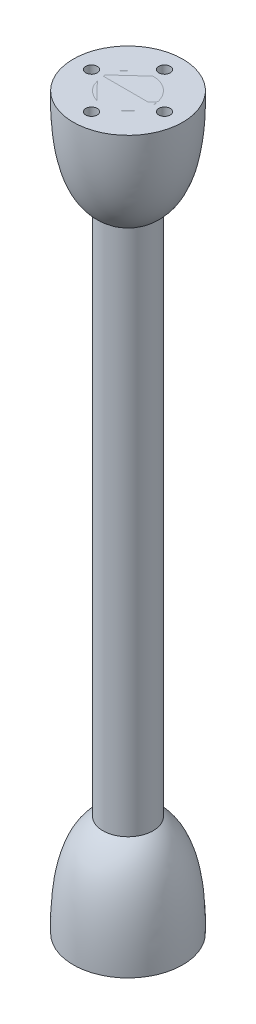
ISO-10303-21;
HEADER;
FILE_DESCRIPTION(('STEP AP214'),'2;1');
FILE_NAME('part.step','',(''),(''),'','','');
FILE_SCHEMA(('AUTOMOTIVE_DESIGN { 1 0 10303 214 1 1 1 1 }'));
ENDSEC;
DATA;
#1=APPLICATION_CONTEXT('core data for automotive mechanical design processes');
#2=APPLICATION_PROTOCOL_DEFINITION('international standard','automotive_design',2000,#1);
#3=PRODUCT_CONTEXT('',#1,'mechanical');
#4=PRODUCT('Part','Part','',(#3));
#5=PRODUCT_RELATED_PRODUCT_CATEGORY('part','',(#4));
#6=PRODUCT_DEFINITION_FORMATION('','',#4);
#7=PRODUCT_DEFINITION_CONTEXT('part definition',#1,'design');
#8=PRODUCT_DEFINITION('design','',#6,#7);
#9=PRODUCT_DEFINITION_SHAPE('','',#8);
#10=(LENGTH_UNIT() NAMED_UNIT(*) SI_UNIT(.MILLI.,.METRE.));
#11=(NAMED_UNIT(*) PLANE_ANGLE_UNIT() SI_UNIT($,.RADIAN.));
#12=(NAMED_UNIT(*) SI_UNIT($,.STERADIAN.) SOLID_ANGLE_UNIT());
#13=UNCERTAINTY_MEASURE_WITH_UNIT(LENGTH_MEASURE(1.E-05),#10,'distance_accuracy_value','');
#14=(GEOMETRIC_REPRESENTATION_CONTEXT(3) GLOBAL_UNCERTAINTY_ASSIGNED_CONTEXT((#13)) GLOBAL_UNIT_ASSIGNED_CONTEXT((#10,
#11,#12)) REPRESENTATION_CONTEXT('',''));
#15=CARTESIAN_POINT('',(0.,0.,0.));
#16=DIRECTION('',(0.,0.,1.));
#17=DIRECTION('',(1.,0.,0.));
#18=AXIS2_PLACEMENT_3D('',#15,#16,#17);
#19=CARTESIAN_POINT('',(0.,215.9,0.));
#20=CARTESIAN_POINT('',(19.7530600429032,216.871645918133,0.));
#21=CARTESIAN_POINT('',(19.05,254.,0.));
#22=B_SPLINE_CURVE_WITH_KNOTS('',2,(#19,#20,#21),.UNSPECIFIED.,.F.,.F.,(3,3),(0.,1.),.UNSPECIFIED.);
#23=CARTESIAN_POINT('',(0.,0.,0.));
#24=DIRECTION('',(0.,-1.,0.));
#25=AXIS1_PLACEMENT('',#23,#24);
#26=SURFACE_OF_REVOLUTION('',#22,#25);
#27=CARTESIAN_POINT('',(0.,254.,0.));
#28=DIRECTION('',(0.,-1.,0.));
#29=DIRECTION('',(0.,0.,-1.));
#30=AXIS2_PLACEMENT_3D('',#27,#28,#29);
#31=CIRCLE('',#30,19.05);
#32=CARTESIAN_POINT('',(0.,254.,-19.05));
#33=VERTEX_POINT('',#32);
#34=EDGE_CURVE('E12',#33,#33,#31,.T.);
#35=ORIENTED_EDGE('',*,*,#34,.T.);
#36=EDGE_LOOP('',(#35));
#37=FACE_BOUND('',#36,.T.);
#38=CARTESIAN_POINT('',(0.,215.9,0.));
#39=VERTEX_POINT('',#38);
#40=VERTEX_LOOP('',#39);
#41=FACE_BOUND('',#40,.T.);
#42=ADVANCED_FACE('F47',(#37,#41),#26,.F.);
#43=CARTESIAN_POINT('',(0.,254.,0.));
#44=DIRECTION('',(0.,1.,0.));
#45=DIRECTION('',(0.,0.,1.));
#46=AXIS2_PLACEMENT_3D('',#43,#44,#45);
#47=PLANE('',#46);
#48=CARTESIAN_POINT('',(12.7,254.,0.));
#49=DIRECTION('',(0.,1.,0.));
#50=DIRECTION('',(0.,0.,1.));
#51=AXIS2_PLACEMENT_3D('',#48,#49,#50);
#52=CIRCLE('',#51,2.00000006400001);
#53=CARTESIAN_POINT('',(12.7,254.,2.00000006400001));
#54=VERTEX_POINT('',#53);
#55=EDGE_CURVE('E105',#54,#54,#52,.T.);
#56=ORIENTED_EDGE('',*,*,#55,.F.);
#57=EDGE_LOOP('',(#56));
#58=FACE_BOUND('',#57,.T.);
#59=CARTESIAN_POINT('',(-12.7,254.,0.));
#60=DIRECTION('',(0.,1.,0.));
#61=DIRECTION('',(0.,0.,1.));
#62=AXIS2_PLACEMENT_3D('',#59,#60,#61);
#63=CIRCLE('',#62,2.000000064);
#64=CARTESIAN_POINT('',(-12.7,254.,2.000000064));
#65=VERTEX_POINT('',#64);
#66=EDGE_CURVE('E108',#65,#65,#63,.T.);
#67=ORIENTED_EDGE('',*,*,#66,.F.);
#68=EDGE_LOOP('',(#67));
#69=FACE_BOUND('',#68,.T.);
#70=CARTESIAN_POINT('',(0.,254.,-12.7));
#71=DIRECTION('',(0.,1.,0.));
#72=DIRECTION('',(0.,0.,1.));
#73=AXIS2_PLACEMENT_3D('',#70,#71,#72);
#74=CIRCLE('',#73,2.000000064);
#75=CARTESIAN_POINT('',(0.,254.,-10.699999936));
#76=VERTEX_POINT('',#75);
#77=EDGE_CURVE('E116',#76,#76,#74,.T.);
#78=ORIENTED_EDGE('',*,*,#77,.F.);
#79=EDGE_LOOP('',(#78));
#80=FACE_BOUND('',#79,.T.);
#81=CARTESIAN_POINT('',(0.,254.,12.7));
#82=DIRECTION('',(0.,1.,0.));
#83=DIRECTION('',(0.,0.,1.));
#84=AXIS2_PLACEMENT_3D('',#81,#82,#83);
#85=CIRCLE('',#84,2.000000064);
#86=CARTESIAN_POINT('',(0.,254.,14.700000064));
#87=VERTEX_POINT('',#86);
#88=EDGE_CURVE('E122',#87,#87,#85,.T.);
#89=ORIENTED_EDGE('',*,*,#88,.F.);
#90=EDGE_LOOP('',(#89));
#91=FACE_BOUND('',#90,.T.);
#92=ORIENTED_EDGE('',*,*,#34,.F.);
#93=EDGE_LOOP('',(#92));
#94=FACE_BOUND('',#93,.T.);
#95=ADVANCED_FACE('F57',(#58,#69,#80,#91,#94),#47,.T.);
#96=CARTESIAN_POINT('',(0.,247.00000003,12.7));
#97=DIRECTION('',(0.,1.,0.));
#98=DIRECTION('',(0.,0.,1.));
#99=AXIS2_PLACEMENT_3D('',#96,#97,#98);
#100=CYLINDRICAL_SURFACE('',#99,2.000000064);
#101=CARTESIAN_POINT('',(0.,247.00000003,12.7));
#102=DIRECTION('',(0.,1.,0.));
#103=DIRECTION('',(0.,0.,1.));
#104=AXIS2_PLACEMENT_3D('',#101,#102,#103);
#105=CIRCLE('',#104,2.000000064);
#106=CARTESIAN_POINT('',(0.,247.00000003,14.700000064));
#107=VERTEX_POINT('',#106);
#108=EDGE_CURVE('E125',#107,#107,#105,.T.);
#109=ORIENTED_EDGE('',*,*,#108,.F.);
#110=EDGE_LOOP('',(#109));
#111=FACE_BOUND('',#110,.T.);
#112=ORIENTED_EDGE('',*,*,#88,.T.);
#113=EDGE_LOOP('',(#112));
#114=FACE_BOUND('',#113,.T.);
#115=ADVANCED_FACE('F62',(#111,#114),#100,.F.);
#116=CARTESIAN_POINT('',(0.,247.00000003,12.7));
#117=DIRECTION('',(0.,1.,0.));
#118=DIRECTION('',(0.,0.,1.));
#119=AXIS2_PLACEMENT_3D('',#116,#117,#118);
#120=PLANE('',#119);
#121=ORIENTED_EDGE('',*,*,#108,.T.);
#122=EDGE_LOOP('',(#121));
#123=FACE_BOUND('',#122,.T.);
#124=ADVANCED_FACE('F69',(#123),#120,.T.);
#125=CARTESIAN_POINT('',(0.,247.00000003,-12.7));
#126=DIRECTION('',(0.,1.,0.));
#127=DIRECTION('',(0.,0.,1.));
#128=AXIS2_PLACEMENT_3D('',#125,#126,#127);
#129=CYLINDRICAL_SURFACE('',#128,2.000000064);
#130=CARTESIAN_POINT('',(0.,247.00000003,-12.7));
#131=DIRECTION('',(0.,1.,0.));
#132=DIRECTION('',(0.,0.,1.));
#133=AXIS2_PLACEMENT_3D('',#130,#131,#132);
#134=CIRCLE('',#133,2.000000064);
#135=CARTESIAN_POINT('',(0.,247.00000003,-10.699999936));
#136=VERTEX_POINT('',#135);
#137=EDGE_CURVE('E119',#136,#136,#134,.T.);
#138=ORIENTED_EDGE('',*,*,#137,.F.);
#139=EDGE_LOOP('',(#138));
#140=FACE_BOUND('',#139,.T.);
#141=ORIENTED_EDGE('',*,*,#77,.T.);
#142=EDGE_LOOP('',(#141));
#143=FACE_BOUND('',#142,.T.);
#144=ADVANCED_FACE('F76',(#140,#143),#129,.F.);
#145=CARTESIAN_POINT('',(0.,247.00000003,-12.7));
#146=DIRECTION('',(0.,1.,0.));
#147=DIRECTION('',(0.,0.,1.));
#148=AXIS2_PLACEMENT_3D('',#145,#146,#147);
#149=PLANE('',#148);
#150=ORIENTED_EDGE('',*,*,#137,.T.);
#151=EDGE_LOOP('',(#150));
#152=FACE_BOUND('',#151,.T.);
#153=ADVANCED_FACE('F79',(#152),#149,.T.);
#154=CARTESIAN_POINT('',(-12.7,247.00000003,0.));
#155=DIRECTION('',(0.,1.,0.));
#156=DIRECTION('',(0.,0.,1.));
#157=AXIS2_PLACEMENT_3D('',#154,#155,#156);
#158=CYLINDRICAL_SURFACE('',#157,2.000000064);
#159=CARTESIAN_POINT('',(-12.7,247.00000003,0.));
#160=DIRECTION('',(0.,1.,0.));
#161=DIRECTION('',(0.,0.,1.));
#162=AXIS2_PLACEMENT_3D('',#159,#160,#161);
#163=CIRCLE('',#162,2.000000064);
#164=CARTESIAN_POINT('',(-12.7,247.00000003,2.000000064));
#165=VERTEX_POINT('',#164);
#166=EDGE_CURVE('E113',#165,#165,#163,.T.);
#167=ORIENTED_EDGE('',*,*,#166,.F.);
#168=EDGE_LOOP('',(#167));
#169=FACE_BOUND('',#168,.T.);
#170=ORIENTED_EDGE('',*,*,#66,.T.);
#171=EDGE_LOOP('',(#170));
#172=FACE_BOUND('',#171,.T.);
#173=ADVANCED_FACE('F82',(#169,#172),#158,.F.);
#174=CARTESIAN_POINT('',(-12.7,247.00000003,0.));
#175=DIRECTION('',(0.,1.,0.));
#176=DIRECTION('',(0.,0.,1.));
#177=AXIS2_PLACEMENT_3D('',#174,#175,#176);
#178=PLANE('',#177);
#179=ORIENTED_EDGE('',*,*,#166,.T.);
#180=EDGE_LOOP('',(#179));
#181=FACE_BOUND('',#180,.T.);
#182=ADVANCED_FACE('F87',(#181),#178,.T.);
#183=CARTESIAN_POINT('',(12.7,247.00000003,0.));
#184=DIRECTION('',(0.,1.,0.));
#185=DIRECTION('',(0.,0.,1.));
#186=AXIS2_PLACEMENT_3D('',#183,#184,#185);
#187=CYLINDRICAL_SURFACE('',#186,2.00000006400001);
#188=CARTESIAN_POINT('',(12.7,247.00000003,0.));
#189=DIRECTION('',(0.,1.,0.));
#190=DIRECTION('',(0.,0.,1.));
#191=AXIS2_PLACEMENT_3D('',#188,#189,#190);
#192=CIRCLE('',#191,2.00000006400001);
#193=CARTESIAN_POINT('',(12.7,247.00000003,2.00000006400001));
#194=VERTEX_POINT('',#193);
#195=EDGE_CURVE('E53',#194,#194,#192,.T.);
#196=ORIENTED_EDGE('',*,*,#195,.F.);
#197=EDGE_LOOP('',(#196));
#198=FACE_BOUND('',#197,.T.);
#199=ORIENTED_EDGE('',*,*,#55,.T.);
#200=EDGE_LOOP('',(#199));
#201=FACE_BOUND('',#200,.T.);
#202=ADVANCED_FACE('F90',(#198,#201),#187,.F.);
#203=CARTESIAN_POINT('',(12.7,247.00000003,0.));
#204=DIRECTION('',(0.,1.,0.));
#205=DIRECTION('',(0.,0.,1.));
#206=AXIS2_PLACEMENT_3D('',#203,#204,#205);
#207=PLANE('',#206);
#208=ORIENTED_EDGE('',*,*,#195,.T.);
#209=EDGE_LOOP('',(#208));
#210=FACE_BOUND('',#209,.T.);
#211=ADVANCED_FACE('F97',(#210),#207,.T.);
#212=CLOSED_SHELL('',(#42,#95,#115,#124,#144,#153,#173,#182,#202,#211));
#213=MANIFOLD_SOLID_BREP('B2',#212);
#214=CARTESIAN_POINT('',(0.,0.,0.));
#215=DIRECTION('',(0.,-1.,0.));
#216=DIRECTION('',(0.,0.,-1.));
#217=AXIS2_PLACEMENT_3D('',#214,#215,#216);
#218=PLANE('',#217);
#219=CARTESIAN_POINT('',(12.7,0.,0.));
#220=DIRECTION('',(0.,-1.,0.));
#221=DIRECTION('',(0.,0.,-1.));
#222=AXIS2_PLACEMENT_3D('',#219,#220,#221);
#223=CIRCLE('',#222,2.000000064);
#224=CARTESIAN_POINT('',(12.7,0.,-2.000000064));
#225=VERTEX_POINT('',#224);
#226=EDGE_CURVE('E278',#225,#225,#223,.T.);
#227=ORIENTED_EDGE('',*,*,#226,.F.);
#228=EDGE_LOOP('',(#227));
#229=FACE_BOUND('',#228,.T.);
#230=CARTESIAN_POINT('',(-12.7,0.,0.));
#231=DIRECTION('',(0.,-1.,0.));
#232=DIRECTION('',(0.,0.,-1.));
#233=AXIS2_PLACEMENT_3D('',#230,#231,#232);
#234=CIRCLE('',#233,2.000000064);
#235=CARTESIAN_POINT('',(-12.7,0.,-2.000000064));
#236=VERTEX_POINT('',#235);
#237=EDGE_CURVE('E282',#236,#236,#234,.T.);
#238=ORIENTED_EDGE('',*,*,#237,.F.);
#239=EDGE_LOOP('',(#238));
#240=FACE_BOUND('',#239,.T.);
#241=CARTESIAN_POINT('',(0.,0.,12.7));
#242=DIRECTION('',(0.,-1.,0.));
#243=DIRECTION('',(0.,0.,-1.));
#244=AXIS2_PLACEMENT_3D('',#241,#242,#243);
#245=CIRCLE('',#244,2.000000064);
#246=CARTESIAN_POINT('',(0.,0.,10.699999936));
#247=VERTEX_POINT('',#246);
#248=EDGE_CURVE('E286',#247,#247,#245,.T.);
#249=ORIENTED_EDGE('',*,*,#248,.F.);
#250=EDGE_LOOP('',(#249));
#251=FACE_BOUND('',#250,.T.);
#252=CARTESIAN_POINT('',(0.,0.,-12.7));
#253=DIRECTION('',(0.,-1.,0.));
#254=DIRECTION('',(0.,0.,-1.));
#255=AXIS2_PLACEMENT_3D('',#252,#253,#254);
#256=CIRCLE('',#255,2.000000064);
#257=CARTESIAN_POINT('',(0.,0.,-14.700000064));
#258=VERTEX_POINT('',#257);
#259=EDGE_CURVE('E289',#258,#258,#256,.T.);
#260=ORIENTED_EDGE('',*,*,#259,.F.);
#261=EDGE_LOOP('',(#260));
#262=FACE_BOUND('',#261,.T.);
#263=CARTESIAN_POINT('',(0.,0.,0.));
#264=DIRECTION('',(0.,-1.,0.));
#265=DIRECTION('',(0.,0.,-1.));
#266=AXIS2_PLACEMENT_3D('',#263,#264,#265);
#267=CIRCLE('',#266,19.05);
#268=CARTESIAN_POINT('',(0.,0.,-19.05));
#269=VERTEX_POINT('',#268);
#270=EDGE_CURVE('E208',#269,#269,#267,.T.);
#271=ORIENTED_EDGE('',*,*,#270,.T.);
#272=EDGE_LOOP('',(#271));
#273=FACE_BOUND('',#272,.T.);
#274=ADVANCED_FACE('F202',(#229,#240,#251,#262,#273),#218,.T.);
#275=CARTESIAN_POINT('',(19.05,0.,0.));
#276=CARTESIAN_POINT('',(19.7530600429032,37.128354081867,0.));
#277=CARTESIAN_POINT('',(0.,38.1,0.));
#278=B_SPLINE_CURVE_WITH_KNOTS('',2,(#275,#276,#277),.UNSPECIFIED.,.F.,.F.,(3,3),(0.,1.),.UNSPECIFIED.);
#279=CARTESIAN_POINT('',(0.,0.,0.));
#280=DIRECTION('',(0.,-1.,0.));
#281=AXIS1_PLACEMENT('',#279,#280);
#282=SURFACE_OF_REVOLUTION('',#278,#281);
#283=CARTESIAN_POINT('',(0.,35.2622308884157,0.));
#284=DIRECTION('',(0.,-1.,0.));
#285=DIRECTION('',(0.,0.,-1.));
#286=AXIS2_PLACEMENT_3D('',#283,#284,#285);
#287=CIRCLE('',#286,8.73125);
#288=CARTESIAN_POINT('',(0.,35.2622308884157,-8.73125));
#289=VERTEX_POINT('',#288);
#290=EDGE_CURVE('E46',#289,#289,#287,.F.);
#291=ORIENTED_EDGE('',*,*,#290,.F.);
#292=EDGE_LOOP('',(#291));
#293=FACE_BOUND('',#292,.T.);
#294=ORIENTED_EDGE('',*,*,#270,.F.);
#295=EDGE_LOOP('',(#294));
#296=FACE_BOUND('',#295,.T.);
#297=ADVANCED_FACE('F226',(#293,#296),#282,.F.);
#298=CARTESIAN_POINT('',(0.,254.,0.));
#299=DIRECTION('',(0.,-1.,0.));
#300=DIRECTION('',(0.,0.,-1.));
#301=AXIS2_PLACEMENT_3D('',#298,#299,#300);
#302=CYLINDRICAL_SURFACE('',#301,8.73125);
#303=ORIENTED_EDGE('',*,*,#290,.T.);
#304=EDGE_LOOP('',(#303));
#305=FACE_BOUND('',#304,.T.);
#306=CARTESIAN_POINT('',(0.,254.,0.));
#307=DIRECTION('',(0.,-1.,0.));
#308=DIRECTION('',(0.,0.,-1.));
#309=AXIS2_PLACEMENT_3D('',#306,#307,#308);
#310=CIRCLE('',#309,8.73125);
#311=CARTESIAN_POINT('',(0.,254.,-8.73125));
#312=VERTEX_POINT('',#311);
#313=EDGE_CURVE('E212',#312,#312,#310,.T.);
#314=ORIENTED_EDGE('',*,*,#313,.T.);
#315=EDGE_LOOP('',(#314));
#316=FACE_BOUND('',#315,.T.);
#317=ADVANCED_FACE('F229',(#305,#316),#302,.T.);
#318=CARTESIAN_POINT('',(0.,254.,0.));
#319=DIRECTION('',(0.,-1.,0.));
#320=DIRECTION('',(0.,0.,-1.));
#321=AXIS2_PLACEMENT_3D('',#318,#319,#320);
#322=PLANE('',#321);
#323=ORIENTED_EDGE('',*,*,#313,.F.);
#324=EDGE_LOOP('',(#323));
#325=FACE_BOUND('',#324,.T.);
#326=ADVANCED_FACE('F233',(#325),#322,.F.);
#327=CARTESIAN_POINT('',(0.,6.99999997,-12.7));
#328=DIRECTION('',(0.,-1.,0.));
#329=DIRECTION('',(0.,0.,-1.));
#330=AXIS2_PLACEMENT_3D('',#327,#328,#329);
#331=CYLINDRICAL_SURFACE('',#330,2.000000064);
#332=CARTESIAN_POINT('',(0.,6.99999997,-12.7));
#333=DIRECTION('',(0.,-1.,0.));
#334=DIRECTION('',(0.,0.,-1.));
#335=AXIS2_PLACEMENT_3D('',#332,#333,#334);
#336=CIRCLE('',#335,2.000000064);
#337=CARTESIAN_POINT('',(0.,6.99999997,-14.700000064));
#338=VERTEX_POINT('',#337);
#339=EDGE_CURVE('E292',#338,#338,#336,.T.);
#340=ORIENTED_EDGE('',*,*,#339,.F.);
#341=EDGE_LOOP('',(#340));
#342=FACE_BOUND('',#341,.T.);
#343=ORIENTED_EDGE('',*,*,#259,.T.);
#344=EDGE_LOOP('',(#343));
#345=FACE_BOUND('',#344,.T.);
#346=ADVANCED_FACE('F236',(#342,#345),#331,.F.);
#347=CARTESIAN_POINT('',(0.,6.99999997,-12.7));
#348=DIRECTION('',(0.,-1.,0.));
#349=DIRECTION('',(0.,0.,-1.));
#350=AXIS2_PLACEMENT_3D('',#347,#348,#349);
#351=PLANE('',#350);
#352=ORIENTED_EDGE('',*,*,#339,.T.);
#353=EDGE_LOOP('',(#352));
#354=FACE_BOUND('',#353,.T.);
#355=ADVANCED_FACE('F238',(#354),#351,.T.);
#356=CARTESIAN_POINT('',(0.,6.99999997,12.7));
#357=DIRECTION('',(0.,-1.,0.));
#358=DIRECTION('',(0.,0.,-1.));
#359=AXIS2_PLACEMENT_3D('',#356,#357,#358);
#360=CYLINDRICAL_SURFACE('',#359,2.000000064);
#361=CARTESIAN_POINT('',(0.,6.99999997,12.7));
#362=DIRECTION('',(0.,-1.,0.));
#363=DIRECTION('',(0.,0.,-1.));
#364=AXIS2_PLACEMENT_3D('',#361,#362,#363);
#365=CIRCLE('',#364,2.000000064);
#366=CARTESIAN_POINT('',(0.,6.99999997,10.699999936));
#367=VERTEX_POINT('',#366);
#368=EDGE_CURVE('E291',#367,#367,#365,.T.);
#369=ORIENTED_EDGE('',*,*,#368,.F.);
#370=EDGE_LOOP('',(#369));
#371=FACE_BOUND('',#370,.T.);
#372=ORIENTED_EDGE('',*,*,#248,.T.);
#373=EDGE_LOOP('',(#372));
#374=FACE_BOUND('',#373,.T.);
#375=ADVANCED_FACE('F241',(#371,#374),#360,.F.);
#376=CARTESIAN_POINT('',(0.,6.99999997,12.7));
#377=DIRECTION('',(0.,-1.,0.));
#378=DIRECTION('',(0.,0.,-1.));
#379=AXIS2_PLACEMENT_3D('',#376,#377,#378);
#380=PLANE('',#379);
#381=ORIENTED_EDGE('',*,*,#368,.T.);
#382=EDGE_LOOP('',(#381));
#383=FACE_BOUND('',#382,.T.);
#384=ADVANCED_FACE('F246',(#383),#380,.T.);
#385=CARTESIAN_POINT('',(-12.7,6.99999997,0.));
#386=DIRECTION('',(0.,-1.,0.));
#387=DIRECTION('',(0.,0.,-1.));
#388=AXIS2_PLACEMENT_3D('',#385,#386,#387);
#389=CYLINDRICAL_SURFACE('',#388,2.000000064);
#390=CARTESIAN_POINT('',(-12.7,6.99999997,0.));
#391=DIRECTION('',(0.,-1.,0.));
#392=DIRECTION('',(0.,0.,-1.));
#393=AXIS2_PLACEMENT_3D('',#390,#391,#392);
#394=CIRCLE('',#393,2.000000064);
#395=CARTESIAN_POINT('',(-12.7,6.99999997,-2.000000064));
#396=VERTEX_POINT('',#395);
#397=EDGE_CURVE('E299',#396,#396,#394,.T.);
#398=ORIENTED_EDGE('',*,*,#397,.F.);
#399=EDGE_LOOP('',(#398));
#400=FACE_BOUND('',#399,.T.);
#401=ORIENTED_EDGE('',*,*,#237,.T.);
#402=EDGE_LOOP('',(#401));
#403=FACE_BOUND('',#402,.T.);
#404=ADVANCED_FACE('F249',(#400,#403),#389,.F.);
#405=CARTESIAN_POINT('',(-12.7,6.99999997,0.));
#406=DIRECTION('',(0.,-1.,0.));
#407=DIRECTION('',(0.,0.,-1.));
#408=AXIS2_PLACEMENT_3D('',#405,#406,#407);
#409=PLANE('',#408);
#410=ORIENTED_EDGE('',*,*,#397,.T.);
#411=EDGE_LOOP('',(#410));
#412=FACE_BOUND('',#411,.T.);
#413=ADVANCED_FACE('F254',(#412),#409,.T.);
#414=CARTESIAN_POINT('',(12.7,6.99999997,0.));
#415=DIRECTION('',(0.,-1.,0.));
#416=DIRECTION('',(0.,0.,-1.));
#417=AXIS2_PLACEMENT_3D('',#414,#415,#416);
#418=CYLINDRICAL_SURFACE('',#417,2.000000064);
#419=CARTESIAN_POINT('',(12.7,6.99999997,0.));
#420=DIRECTION('',(0.,-1.,0.));
#421=DIRECTION('',(0.,0.,-1.));
#422=AXIS2_PLACEMENT_3D('',#419,#420,#421);
#423=CIRCLE('',#422,2.000000064);
#424=CARTESIAN_POINT('',(12.7,6.99999997,-2.000000064));
#425=VERTEX_POINT('',#424);
#426=EDGE_CURVE('E216',#425,#425,#423,.T.);
#427=ORIENTED_EDGE('',*,*,#426,.F.);
#428=EDGE_LOOP('',(#427));
#429=FACE_BOUND('',#428,.T.);
#430=ORIENTED_EDGE('',*,*,#226,.T.);
#431=EDGE_LOOP('',(#430));
#432=FACE_BOUND('',#431,.T.);
#433=ADVANCED_FACE('F257',(#429,#432),#418,.F.);
#434=CARTESIAN_POINT('',(12.7,6.99999997,0.));
#435=DIRECTION('',(0.,-1.,0.));
#436=DIRECTION('',(0.,0.,-1.));
#437=AXIS2_PLACEMENT_3D('',#434,#435,#436);
#438=PLANE('',#437);
#439=ORIENTED_EDGE('',*,*,#426,.T.);
#440=EDGE_LOOP('',(#439));
#441=FACE_BOUND('',#440,.T.);
#442=ADVANCED_FACE('F264',(#441),#438,.T.);
#443=CLOSED_SHELL('',(#274,#297,#317,#326,#346,#355,#375,#384,#404,#413,#433,#442));
#444=MANIFOLD_SOLID_BREP('B6',#443);
#445=ADVANCED_BREP_SHAPE_REPRESENTATION('',(#18,#213,#444),#14);
#446=SHAPE_DEFINITION_REPRESENTATION(#9,#445);
ENDSEC;
END-ISO-10303-21;
